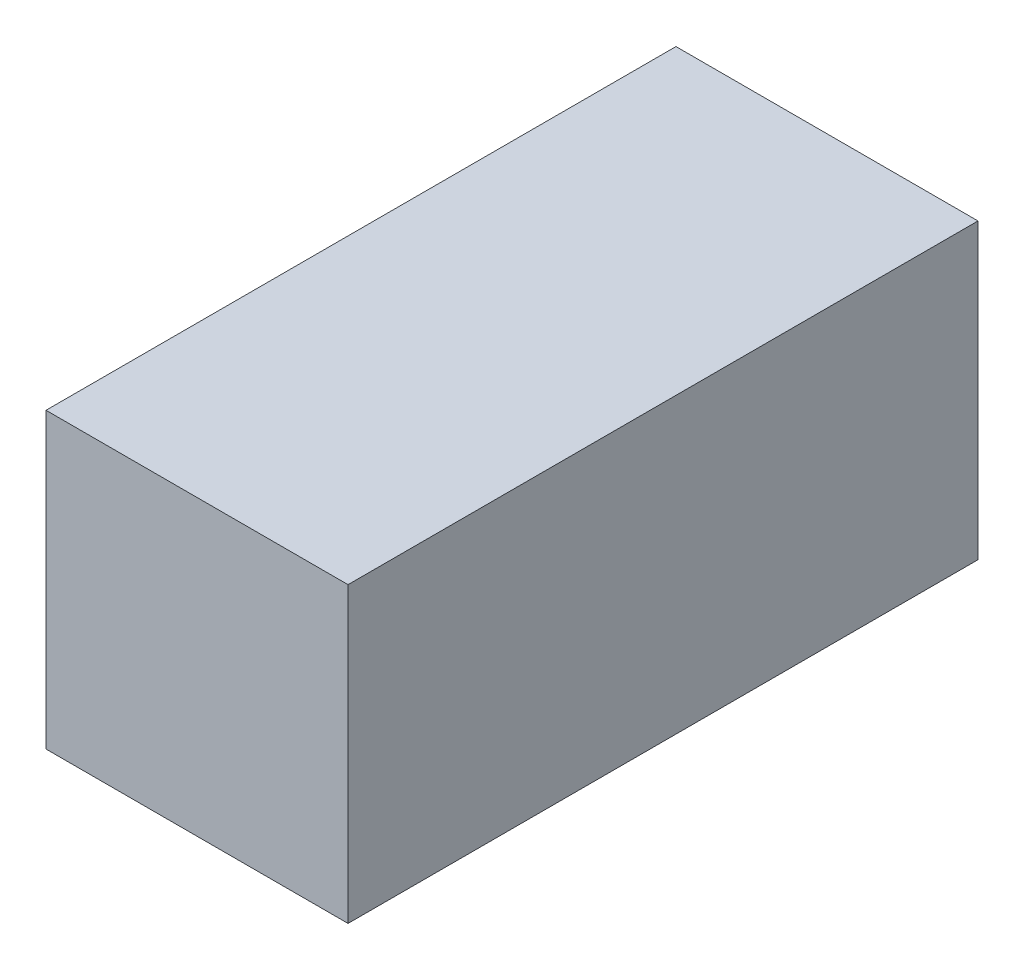
ISO-10303-21;
HEADER;
FILE_DESCRIPTION(('STEP AP214'),'2;1');
FILE_NAME('part.step','',(''),(''),'','','');
FILE_SCHEMA(('AUTOMOTIVE_DESIGN { 1 0 10303 214 1 1 1 1 }'));
ENDSEC;
DATA;
#1=APPLICATION_CONTEXT('core data for automotive mechanical design processes');
#2=APPLICATION_PROTOCOL_DEFINITION('international standard','automotive_design',2000,#1);
#3=PRODUCT_CONTEXT('',#1,'mechanical');
#4=PRODUCT('Part','Part','',(#3));
#5=PRODUCT_RELATED_PRODUCT_CATEGORY('part','',(#4));
#6=PRODUCT_DEFINITION_FORMATION('','',#4);
#7=PRODUCT_DEFINITION_CONTEXT('part definition',#1,'design');
#8=PRODUCT_DEFINITION('design','',#6,#7);
#9=PRODUCT_DEFINITION_SHAPE('','',#8);
#10=(LENGTH_UNIT() NAMED_UNIT(*) SI_UNIT(.MILLI.,.METRE.));
#11=(NAMED_UNIT(*) PLANE_ANGLE_UNIT() SI_UNIT($,.RADIAN.));
#12=(NAMED_UNIT(*) SI_UNIT($,.STERADIAN.) SOLID_ANGLE_UNIT());
#13=UNCERTAINTY_MEASURE_WITH_UNIT(LENGTH_MEASURE(1.E-05),#10,'distance_accuracy_value','');
#14=(GEOMETRIC_REPRESENTATION_CONTEXT(3) GLOBAL_UNCERTAINTY_ASSIGNED_CONTEXT((#13)) GLOBAL_UNIT_ASSIGNED_CONTEXT((#10,
#11,#12)) REPRESENTATION_CONTEXT('',''));
#15=CARTESIAN_POINT('',(0.,0.,0.));
#16=DIRECTION('',(0.,0.,1.));
#17=DIRECTION('',(1.,0.,0.));
#18=AXIS2_PLACEMENT_3D('',#15,#16,#17);
#19=CARTESIAN_POINT('',(17.5,17.,0.));
#20=DIRECTION('',(0.,1.,0.));
#21=DIRECTION('',(-1.,0.,0.));
#22=AXIS2_PLACEMENT_3D('',#19,#20,#21);
#23=PLANE('',#22);
#24=DIRECTION('',(1.,0.,0.));
#25=VECTOR('',#24,1.);
#26=CARTESIAN_POINT('',(0.,17.,73.));
#27=LINE('',#26,#25);
#28=CARTESIAN_POINT('',(17.5,17.,73.));
#29=VERTEX_POINT('',#28);
#30=CARTESIAN_POINT('',(-17.5,17.,73.));
#31=VERTEX_POINT('',#30);
#32=EDGE_CURVE('E68',#29,#31,#27,.F.);
#33=ORIENTED_EDGE('',*,*,#32,.F.);
#34=DIRECTION('',(0.,0.,1.));
#35=VECTOR('',#34,1.);
#36=CARTESIAN_POINT('',(17.5,17.,0.));
#37=LINE('',#36,#35);
#38=CARTESIAN_POINT('',(17.5,17.,0.));
#39=VERTEX_POINT('',#38);
#40=EDGE_CURVE('E55',#39,#29,#37,.T.);
#41=ORIENTED_EDGE('',*,*,#40,.F.);
#42=DIRECTION('',(1.,0.,0.));
#43=VECTOR('',#42,1.);
#44=CARTESIAN_POINT('',(0.,17.,0.));
#45=LINE('',#44,#43);
#46=CARTESIAN_POINT('',(-17.5,17.,0.));
#47=VERTEX_POINT('',#46);
#48=EDGE_CURVE('E20',#39,#47,#45,.F.);
#49=ORIENTED_EDGE('',*,*,#48,.T.);
#50=DIRECTION('',(0.,0.,1.));
#51=VECTOR('',#50,1.);
#52=CARTESIAN_POINT('',(-17.5,17.,0.));
#53=LINE('',#52,#51);
#54=EDGE_CURVE('E81',#31,#47,#53,.F.);
#55=ORIENTED_EDGE('',*,*,#54,.F.);
#56=EDGE_LOOP('',(#33,#41,#49,#55));
#57=FACE_BOUND('',#56,.T.);
#58=ADVANCED_FACE('F17',(#57),#23,.T.);
#59=CARTESIAN_POINT('',(0.,0.,0.));
#60=DIRECTION('',(0.,0.,1.));
#61=DIRECTION('',(1.,0.,0.));
#62=AXIS2_PLACEMENT_3D('',#59,#60,#61);
#63=PLANE('',#62);
#64=DIRECTION('',(0.,1.,0.));
#65=VECTOR('',#64,1.);
#66=CARTESIAN_POINT('',(17.5,-17.,0.));
#67=LINE('',#66,#65);
#68=CARTESIAN_POINT('',(17.5,-17.,0.));
#69=VERTEX_POINT('',#68);
#70=EDGE_CURVE('E61',#69,#39,#67,.T.);
#71=ORIENTED_EDGE('',*,*,#70,.F.);
#72=DIRECTION('',(1.,0.,0.));
#73=VECTOR('',#72,1.);
#74=CARTESIAN_POINT('',(-17.5,-17.,0.));
#75=LINE('',#74,#73);
#76=CARTESIAN_POINT('',(-17.5,-17.,0.));
#77=VERTEX_POINT('',#76);
#78=EDGE_CURVE('E83',#77,#69,#75,.T.);
#79=ORIENTED_EDGE('',*,*,#78,.F.);
#80=DIRECTION('',(0.,-1.,0.));
#81=VECTOR('',#80,1.);
#82=CARTESIAN_POINT('',(-17.5,17.,0.));
#83=LINE('',#82,#81);
#84=EDGE_CURVE('E64',#47,#77,#83,.T.);
#85=ORIENTED_EDGE('',*,*,#84,.F.);
#86=ORIENTED_EDGE('',*,*,#48,.F.);
#87=EDGE_LOOP('',(#71,#79,#85,#86));
#88=FACE_BOUND('',#87,.T.);
#89=ADVANCED_FACE('F60',(#88),#63,.F.);
#90=CARTESIAN_POINT('',(17.5,-17.,0.));
#91=DIRECTION('',(1.,0.,0.));
#92=DIRECTION('',(0.,1.,0.));
#93=AXIS2_PLACEMENT_3D('',#90,#91,#92);
#94=PLANE('',#93);
#95=DIRECTION('',(0.,1.,0.));
#96=VECTOR('',#95,1.);
#97=CARTESIAN_POINT('',(17.5,0.,73.));
#98=LINE('',#97,#96);
#99=CARTESIAN_POINT('',(17.5,-17.,73.));
#100=VERTEX_POINT('',#99);
#101=EDGE_CURVE('E70',#100,#29,#98,.T.);
#102=ORIENTED_EDGE('',*,*,#101,.F.);
#103=DIRECTION('',(0.,0.,1.));
#104=VECTOR('',#103,1.);
#105=CARTESIAN_POINT('',(17.5,-17.,0.));
#106=LINE('',#105,#104);
#107=EDGE_CURVE('E74',#69,#100,#106,.T.);
#108=ORIENTED_EDGE('',*,*,#107,.F.);
#109=ORIENTED_EDGE('',*,*,#70,.T.);
#110=ORIENTED_EDGE('',*,*,#40,.T.);
#111=EDGE_LOOP('',(#102,#108,#109,#110));
#112=FACE_BOUND('',#111,.T.);
#113=ADVANCED_FACE('F72',(#112),#94,.T.);
#114=CARTESIAN_POINT('',(0.,0.,73.));
#115=DIRECTION('',(0.,0.,1.));
#116=DIRECTION('',(1.,0.,0.));
#117=AXIS2_PLACEMENT_3D('',#114,#115,#116);
#118=PLANE('',#117);
#119=ORIENTED_EDGE('',*,*,#101,.T.);
#120=ORIENTED_EDGE('',*,*,#32,.T.);
#121=DIRECTION('',(0.,-1.,0.));
#122=VECTOR('',#121,1.);
#123=CARTESIAN_POINT('',(-17.5,17.,73.));
#124=LINE('',#123,#122);
#125=CARTESIAN_POINT('',(-17.5,-17.,73.));
#126=VERTEX_POINT('',#125);
#127=EDGE_CURVE('E35',#126,#31,#124,.F.);
#128=ORIENTED_EDGE('',*,*,#127,.F.);
#129=DIRECTION('',(1.,0.,0.));
#130=VECTOR('',#129,1.);
#131=CARTESIAN_POINT('',(-17.5,-17.,73.));
#132=LINE('',#131,#130);
#133=EDGE_CURVE('E26',#100,#126,#132,.F.);
#134=ORIENTED_EDGE('',*,*,#133,.F.);
#135=EDGE_LOOP('',(#119,#120,#128,#134));
#136=FACE_BOUND('',#135,.T.);
#137=ADVANCED_FACE('F89',(#136),#118,.T.);
#138=CARTESIAN_POINT('',(-17.5,17.,0.));
#139=DIRECTION('',(-1.,0.,0.));
#140=DIRECTION('',(0.,-1.,0.));
#141=AXIS2_PLACEMENT_3D('',#138,#139,#140);
#142=PLANE('',#141);
#143=ORIENTED_EDGE('',*,*,#127,.T.);
#144=ORIENTED_EDGE('',*,*,#54,.T.);
#145=ORIENTED_EDGE('',*,*,#84,.T.);
#146=DIRECTION('',(0.,0.,1.));
#147=VECTOR('',#146,1.);
#148=CARTESIAN_POINT('',(-17.5,-17.,0.));
#149=LINE('',#148,#147);
#150=EDGE_CURVE('E11',#126,#77,#149,.F.);
#151=ORIENTED_EDGE('',*,*,#150,.F.);
#152=EDGE_LOOP('',(#143,#144,#145,#151));
#153=FACE_BOUND('',#152,.T.);
#154=ADVANCED_FACE('F91',(#153),#142,.T.);
#155=CARTESIAN_POINT('',(-17.5,-17.,0.));
#156=DIRECTION('',(0.,-1.,0.));
#157=DIRECTION('',(1.,0.,0.));
#158=AXIS2_PLACEMENT_3D('',#155,#156,#157);
#159=PLANE('',#158);
#160=ORIENTED_EDGE('',*,*,#133,.T.);
#161=ORIENTED_EDGE('',*,*,#150,.T.);
#162=ORIENTED_EDGE('',*,*,#78,.T.);
#163=ORIENTED_EDGE('',*,*,#107,.T.);
#164=EDGE_LOOP('',(#160,#161,#162,#163));
#165=FACE_BOUND('',#164,.T.);
#166=ADVANCED_FACE('F88',(#165),#159,.T.);
#167=CLOSED_SHELL('',(#58,#89,#113,#137,#154,#166));
#168=MANIFOLD_SOLID_BREP('B1',#167);
#169=ADVANCED_BREP_SHAPE_REPRESENTATION('',(#18,#168),#14);
#170=SHAPE_DEFINITION_REPRESENTATION(#9,#169);
ENDSEC;
END-ISO-10303-21;
